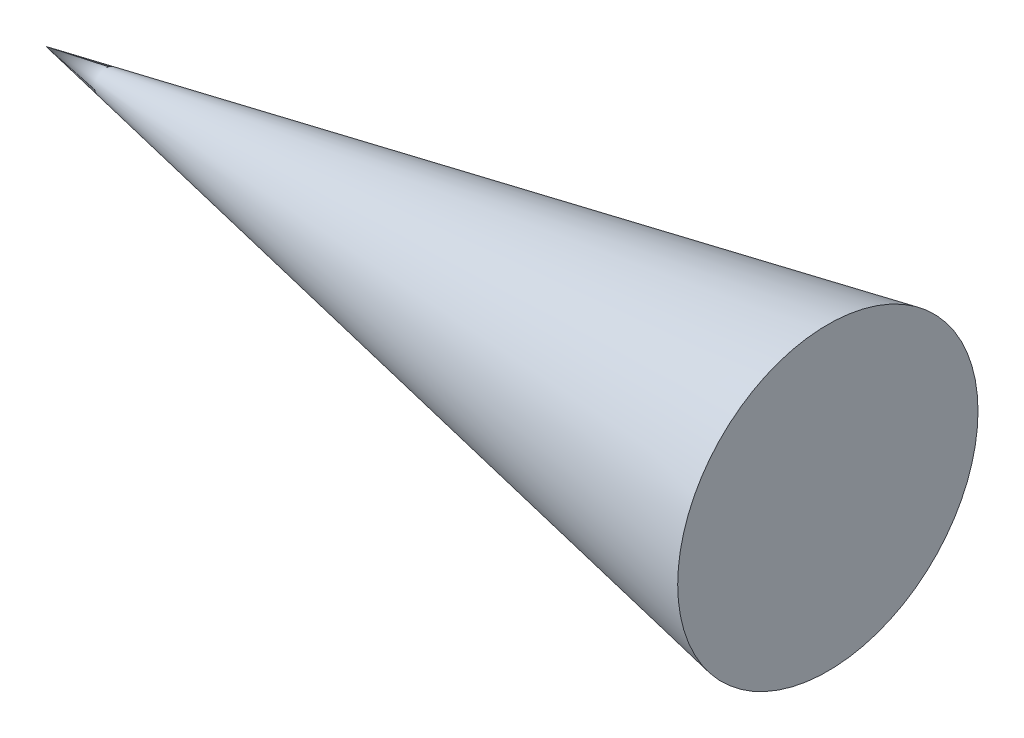
ISO-10303-21;
HEADER;
FILE_DESCRIPTION(('STEP AP214'),'2;1');
FILE_NAME('part.step','',(''),(''),'','','');
FILE_SCHEMA(('AUTOMOTIVE_DESIGN { 1 0 10303 214 1 1 1 1 }'));
ENDSEC;
DATA;
#1=APPLICATION_CONTEXT('core data for automotive mechanical design processes');
#2=APPLICATION_PROTOCOL_DEFINITION('international standard','automotive_design',2000,#1);
#3=PRODUCT_CONTEXT('',#1,'mechanical');
#4=PRODUCT('Part','Part','',(#3));
#5=PRODUCT_RELATED_PRODUCT_CATEGORY('part','',(#4));
#6=PRODUCT_DEFINITION_FORMATION('','',#4);
#7=PRODUCT_DEFINITION_CONTEXT('part definition',#1,'design');
#8=PRODUCT_DEFINITION('design','',#6,#7);
#9=PRODUCT_DEFINITION_SHAPE('','',#8);
#10=(LENGTH_UNIT() NAMED_UNIT(*) SI_UNIT(.MILLI.,.METRE.));
#11=(NAMED_UNIT(*) PLANE_ANGLE_UNIT() SI_UNIT($,.RADIAN.));
#12=(NAMED_UNIT(*) SI_UNIT($,.STERADIAN.) SOLID_ANGLE_UNIT());
#13=UNCERTAINTY_MEASURE_WITH_UNIT(LENGTH_MEASURE(1.E-05),#10,'distance_accuracy_value','');
#14=(GEOMETRIC_REPRESENTATION_CONTEXT(3) GLOBAL_UNCERTAINTY_ASSIGNED_CONTEXT((#13)) GLOBAL_UNIT_ASSIGNED_CONTEXT((#10,
#11,#12)) REPRESENTATION_CONTEXT('',''));
#15=CARTESIAN_POINT('',(0.,0.,0.));
#16=DIRECTION('',(0.,0.,1.));
#17=DIRECTION('',(1.,0.,0.));
#18=AXIS2_PLACEMENT_3D('',#15,#16,#17);
#19=CARTESIAN_POINT('',(88.7256908591124,0.,0.));
#20=DIRECTION('',(1.,0.,0.));
#21=DIRECTION('',(0.,0.,-1.));
#22=AXIS2_PLACEMENT_3D('',#19,#20,#21);
#23=CONICAL_SURFACE('',#22,17.04032840521,0.189745855278928);
#24=CARTESIAN_POINT('',(0.,0.,0.));
#25=VERTEX_POINT('',#24);
#26=VERTEX_LOOP('',#25);
#27=FACE_BOUND('',#26,.T.);
#28=CARTESIAN_POINT('',(88.7256908591124,0.,0.));
#29=DIRECTION('',(-1.,0.,0.));
#30=DIRECTION('',(0.,0.,1.));
#31=AXIS2_PLACEMENT_3D('',#28,#29,#30);
#32=CIRCLE('',#31,17.04032840521);
#33=CARTESIAN_POINT('',(88.7256908591124,0.,17.04032840521));
#34=VERTEX_POINT('',#33);
#35=EDGE_CURVE('E11',#34,#34,#32,.T.);
#36=ORIENTED_EDGE('',*,*,#35,.T.);
#37=EDGE_LOOP('',(#36));
#38=FACE_BOUND('',#37,.T.);
#39=ADVANCED_FACE('F39',(#27,#38),#23,.T.);
#40=CARTESIAN_POINT('',(88.7256908591124,0.,0.));
#41=DIRECTION('',(-1.,0.,0.));
#42=DIRECTION('',(0.,0.,1.));
#43=AXIS2_PLACEMENT_3D('',#40,#41,#42);
#44=PLANE('',#43);
#45=ORIENTED_EDGE('',*,*,#35,.F.);
#46=EDGE_LOOP('',(#45));
#47=FACE_BOUND('',#46,.T.);
#48=ADVANCED_FACE('F48',(#47),#44,.F.);
#49=CLOSED_SHELL('',(#39,#48));
#50=MANIFOLD_SOLID_BREP('B2',#49);
#51=ADVANCED_BREP_SHAPE_REPRESENTATION('',(#18,#50),#14);
#52=SHAPE_DEFINITION_REPRESENTATION(#9,#51);
ENDSEC;
END-ISO-10303-21;
